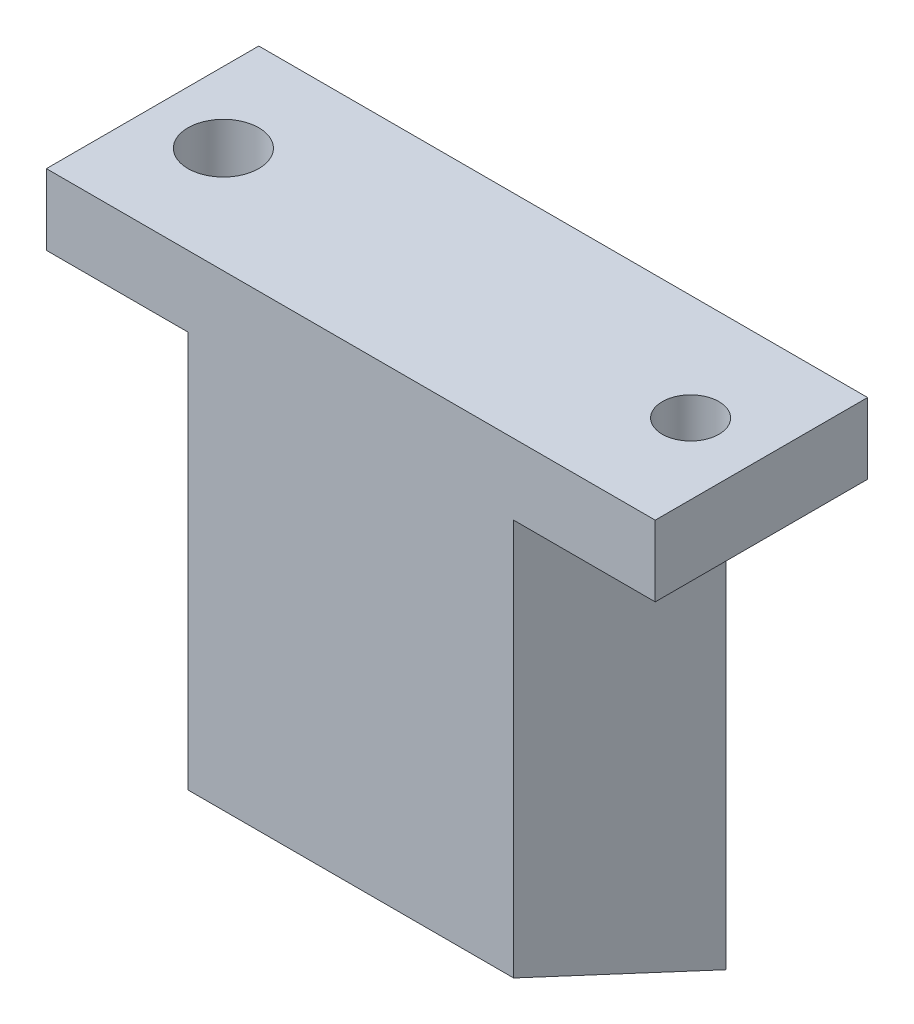
ISO-10303-21;
HEADER;
FILE_DESCRIPTION(('STEP AP214'),'2;1');
FILE_NAME('part.step','',(''),(''),'','','');
FILE_SCHEMA(('AUTOMOTIVE_DESIGN { 1 0 10303 214 1 1 1 1 }'));
ENDSEC;
DATA;
#1=APPLICATION_CONTEXT('core data for automotive mechanical design processes');
#2=APPLICATION_PROTOCOL_DEFINITION('international standard','automotive_design',2000,#1);
#3=PRODUCT_CONTEXT('',#1,'mechanical');
#4=PRODUCT('Part','Part','',(#3));
#5=PRODUCT_RELATED_PRODUCT_CATEGORY('part','',(#4));
#6=PRODUCT_DEFINITION_FORMATION('','',#4);
#7=PRODUCT_DEFINITION_CONTEXT('part definition',#1,'design');
#8=PRODUCT_DEFINITION('design','',#6,#7);
#9=PRODUCT_DEFINITION_SHAPE('','',#8);
#10=(LENGTH_UNIT() NAMED_UNIT(*) SI_UNIT(.MILLI.,.METRE.));
#11=(NAMED_UNIT(*) PLANE_ANGLE_UNIT() SI_UNIT($,.RADIAN.));
#12=(NAMED_UNIT(*) SI_UNIT($,.STERADIAN.) SOLID_ANGLE_UNIT());
#13=UNCERTAINTY_MEASURE_WITH_UNIT(LENGTH_MEASURE(1.E-05),#10,'distance_accuracy_value','');
#14=(GEOMETRIC_REPRESENTATION_CONTEXT(3) GLOBAL_UNCERTAINTY_ASSIGNED_CONTEXT((#13)) GLOBAL_UNIT_ASSIGNED_CONTEXT((#10,
#11,#12)) REPRESENTATION_CONTEXT('',''));
#15=CARTESIAN_POINT('',(0.,0.,0.));
#16=DIRECTION('',(0.,0.,1.));
#17=DIRECTION('',(1.,0.,0.));
#18=AXIS2_PLACEMENT_3D('',#15,#16,#17);
#19=CARTESIAN_POINT('',(-76.9047619047619,40.,-16.0714285714286));
#20=DIRECTION('',(1.,0.,0.));
#21=DIRECTION('',(0.,0.,-1.));
#22=AXIS2_PLACEMENT_3D('',#19,#20,#21);
#23=PLANE('',#22);
#24=DIRECTION('',(0.,0.,1.));
#25=VECTOR('',#24,1.);
#26=CARTESIAN_POINT('',(-76.9047619047619,35.,-16.0714285714286));
#27=LINE('',#26,#25);
#28=CARTESIAN_POINT('',(-76.9047619047619,35.,-16.0714285714286));
#29=VERTEX_POINT('',#28);
#30=CARTESIAN_POINT('',(-76.9047619047619,35.,-1.07142857142857));
#31=VERTEX_POINT('',#30);
#32=EDGE_CURVE('E47',#29,#31,#27,.T.);
#33=ORIENTED_EDGE('',*,*,#32,.F.);
#34=DIRECTION('',(0.,-1.,0.));
#35=VECTOR('',#34,1.);
#36=CARTESIAN_POINT('',(-76.9047619047619,40.,-16.0714285714286));
#37=LINE('',#36,#35);
#38=CARTESIAN_POINT('',(-76.9047619047619,0.,-16.0714285714286));
#39=VERTEX_POINT('',#38);
#40=EDGE_CURVE('E118',#29,#39,#37,.T.);
#41=ORIENTED_EDGE('',*,*,#40,.T.);
#42=DIRECTION('',(0.,0.422618261740694,0.906307787036653));
#43=VECTOR('',#42,1.);
#44=CARTESIAN_POINT('',(-76.9047619047619,7.14424780626901,-0.750539709049177));
#45=LINE('',#44,#43);
#46=CARTESIAN_POINT('',(-76.9047619047619,6.99461487232486,-1.07142857142855));
#47=VERTEX_POINT('',#46);
#48=EDGE_CURVE('E152',#39,#47,#45,.T.);
#49=ORIENTED_EDGE('',*,*,#48,.T.);
#50=DIRECTION('',(0.,-1.,0.));
#51=VECTOR('',#50,1.);
#52=CARTESIAN_POINT('',(-76.9047619047619,40.,-1.07142857142857));
#53=LINE('',#52,#51);
#54=EDGE_CURVE('E11',#31,#47,#53,.T.);
#55=ORIENTED_EDGE('',*,*,#54,.F.);
#56=EDGE_LOOP('',(#33,#41,#49,#55));
#57=FACE_BOUND('',#56,.T.);
#58=ADVANCED_FACE('F33',(#57),#23,.F.);
#59=CARTESIAN_POINT('',(-53.9047619047619,40.,-16.0714285714286));
#60=DIRECTION('',(-1.,0.,0.));
#61=DIRECTION('',(0.,0.,1.));
#62=AXIS2_PLACEMENT_3D('',#59,#60,#61);
#63=PLANE('',#62);
#64=DIRECTION('',(0.,0.,-1.));
#65=VECTOR('',#64,1.);
#66=CARTESIAN_POINT('',(-53.9047619047619,35.,-16.0714285714286));
#67=LINE('',#66,#65);
#68=CARTESIAN_POINT('',(-53.9047619047619,35.,-1.07142857142857));
#69=VERTEX_POINT('',#68);
#70=CARTESIAN_POINT('',(-53.9047619047619,35.,-16.0714285714286));
#71=VERTEX_POINT('',#70);
#72=EDGE_CURVE('E55',#69,#71,#67,.T.);
#73=ORIENTED_EDGE('',*,*,#72,.F.);
#74=DIRECTION('',(0.,-1.,0.));
#75=VECTOR('',#74,1.);
#76=CARTESIAN_POINT('',(-53.9047619047619,40.,-1.07142857142857));
#77=LINE('',#76,#75);
#78=CARTESIAN_POINT('',(-53.9047619047619,6.99461487232486,-1.07142857142855));
#79=VERTEX_POINT('',#78);
#80=EDGE_CURVE('E40',#69,#79,#77,.T.);
#81=ORIENTED_EDGE('',*,*,#80,.T.);
#82=DIRECTION('',(0.,0.422618261740694,0.906307787036653));
#83=VECTOR('',#82,1.);
#84=CARTESIAN_POINT('',(-53.9047619047619,6.99461487232486,-1.07142857142855));
#85=LINE('',#84,#83);
#86=CARTESIAN_POINT('',(-53.9047619047619,0.,-16.0714285714285));
#87=VERTEX_POINT('',#86);
#88=EDGE_CURVE('E146',#87,#79,#85,.T.);
#89=ORIENTED_EDGE('',*,*,#88,.F.);
#90=DIRECTION('',(0.,-1.,0.));
#91=VECTOR('',#90,1.);
#92=CARTESIAN_POINT('',(-53.9047619047619,40.,-16.0714285714286));
#93=LINE('',#92,#91);
#94=EDGE_CURVE('E162',#71,#87,#93,.T.);
#95=ORIENTED_EDGE('',*,*,#94,.F.);
#96=EDGE_LOOP('',(#73,#81,#89,#95));
#97=FACE_BOUND('',#96,.T.);
#98=ADVANCED_FACE('F164',(#97),#63,.F.);
#99=CARTESIAN_POINT('',(-76.9047619047619,40.,-1.07142857142857));
#100=DIRECTION('',(0.,0.,-1.));
#101=DIRECTION('',(-1.,0.,0.));
#102=AXIS2_PLACEMENT_3D('',#99,#100,#101);
#103=PLANE('',#102);
#104=DIRECTION('',(1.,0.,0.));
#105=VECTOR('',#104,1.);
#106=CARTESIAN_POINT('',(-76.9047619047619,40.,-1.07142857142857));
#107=LINE('',#106,#105);
#108=CARTESIAN_POINT('',(-86.9047619047619,40.,-1.07142857142856));
#109=VERTEX_POINT('',#108);
#110=CARTESIAN_POINT('',(-43.9047619047619,40.,-1.07142857142857));
#111=VERTEX_POINT('',#110);
#112=EDGE_CURVE('E156',#109,#111,#107,.T.);
#113=ORIENTED_EDGE('',*,*,#112,.F.);
#114=DIRECTION('',(0.,1.,0.));
#115=VECTOR('',#114,1.);
#116=CARTESIAN_POINT('',(-86.9047619047619,40.,-1.07142857142856));
#117=LINE('',#116,#115);
#118=CARTESIAN_POINT('',(-86.9047619047619,35.,-1.07142857142857));
#119=VERTEX_POINT('',#118);
#120=EDGE_CURVE('E106',#119,#109,#117,.T.);
#121=ORIENTED_EDGE('',*,*,#120,.F.);
#122=DIRECTION('',(1.,0.,0.));
#123=VECTOR('',#122,1.);
#124=CARTESIAN_POINT('',(-86.9047619047619,35.,-1.07142857142857));
#125=LINE('',#124,#123);
#126=EDGE_CURVE('E102',#119,#31,#125,.T.);
#127=ORIENTED_EDGE('',*,*,#126,.T.);
#128=ORIENTED_EDGE('',*,*,#54,.T.);
#129=DIRECTION('',(1.,0.,0.));
#130=VECTOR('',#129,1.);
#131=CARTESIAN_POINT('',(-93.9047619047619,6.99461487232486,-1.07142857142855));
#132=LINE('',#131,#130);
#133=EDGE_CURVE('E149',#47,#79,#132,.T.);
#134=ORIENTED_EDGE('',*,*,#133,.T.);
#135=ORIENTED_EDGE('',*,*,#80,.F.);
#136=DIRECTION('',(-1.,0.,0.));
#137=VECTOR('',#136,1.);
#138=CARTESIAN_POINT('',(-43.9047619047619,35.,-1.07142857142857));
#139=LINE('',#138,#137);
#140=CARTESIAN_POINT('',(-43.9047619047619,35.,-1.07142857142857));
#141=VERTEX_POINT('',#140);
#142=EDGE_CURVE('E137',#141,#69,#139,.T.);
#143=ORIENTED_EDGE('',*,*,#142,.F.);
#144=DIRECTION('',(0.,-1.,0.));
#145=VECTOR('',#144,1.);
#146=CARTESIAN_POINT('',(-43.9047619047619,40.,-1.07142857142857));
#147=LINE('',#146,#145);
#148=EDGE_CURVE('E130',#111,#141,#147,.T.);
#149=ORIENTED_EDGE('',*,*,#148,.F.);
#150=EDGE_LOOP('',(#113,#121,#127,#128,#134,#135,#143,#149));
#151=FACE_BOUND('',#150,.T.);
#152=ADVANCED_FACE('F172',(#151),#103,.F.);
#153=CARTESIAN_POINT('',(-76.9047619047619,40.,-16.0714285714286));
#154=DIRECTION('',(0.,0.,1.));
#155=DIRECTION('',(1.,0.,0.));
#156=AXIS2_PLACEMENT_3D('',#153,#154,#155);
#157=PLANE('',#156);
#158=CARTESIAN_POINT('',(-65.3785954655315,21.4157068063249,-16.0714285714286));
#159=DIRECTION('',(0.,0.,1.));
#160=DIRECTION('',(0.,-1.,0.));
#161=AXIS2_PLACEMENT_3D('',#158,#159,#160);
#162=ELLIPSE('',#161,3.54930237472879,1.5);
#163=CARTESIAN_POINT('',(-65.3785954655315,17.8664044315961,-16.0714285714286));
#164=VERTEX_POINT('',#163);
#165=EDGE_CURVE('E143',#164,#164,#162,.T.);
#166=ORIENTED_EDGE('',*,*,#165,.T.);
#167=EDGE_LOOP('',(#166));
#168=FACE_BOUND('',#167,.T.);
#169=DIRECTION('',(-1.,0.,0.));
#170=VECTOR('',#169,1.);
#171=CARTESIAN_POINT('',(-76.9047619047619,0.,-16.0714285714286));
#172=LINE('',#171,#170);
#173=EDGE_CURVE('E155',#87,#39,#172,.T.);
#174=ORIENTED_EDGE('',*,*,#173,.T.);
#175=ORIENTED_EDGE('',*,*,#40,.F.);
#176=DIRECTION('',(1.,0.,0.));
#177=VECTOR('',#176,1.);
#178=CARTESIAN_POINT('',(-86.9047619047619,35.,-16.0714285714286));
#179=LINE('',#178,#177);
#180=CARTESIAN_POINT('',(-86.9047619047619,35.,-16.0714285714286));
#181=VERTEX_POINT('',#180);
#182=EDGE_CURVE('E100',#181,#29,#179,.T.);
#183=ORIENTED_EDGE('',*,*,#182,.F.);
#184=DIRECTION('',(0.,-1.,0.));
#185=VECTOR('',#184,1.);
#186=CARTESIAN_POINT('',(-86.9047619047619,40.,-16.0714285714286));
#187=LINE('',#186,#185);
#188=CARTESIAN_POINT('',(-86.9047619047619,40.,-16.0714285714286));
#189=VERTEX_POINT('',#188);
#190=EDGE_CURVE('E107',#189,#181,#187,.T.);
#191=ORIENTED_EDGE('',*,*,#190,.F.);
#192=DIRECTION('',(-1.,0.,0.));
#193=VECTOR('',#192,1.);
#194=CARTESIAN_POINT('',(-76.9047619047619,40.,-16.0714285714286));
#195=LINE('',#194,#193);
#196=CARTESIAN_POINT('',(-43.9047619047619,40.,-16.0714285714286));
#197=VERTEX_POINT('',#196);
#198=EDGE_CURVE('E158',#197,#189,#195,.T.);
#199=ORIENTED_EDGE('',*,*,#198,.F.);
#200=DIRECTION('',(0.,1.,0.));
#201=VECTOR('',#200,1.);
#202=CARTESIAN_POINT('',(-43.9047619047619,40.,-16.0714285714286));
#203=LINE('',#202,#201);
#204=CARTESIAN_POINT('',(-43.9047619047619,35.,-16.0714285714286));
#205=VERTEX_POINT('',#204);
#206=EDGE_CURVE('E120',#205,#197,#203,.T.);
#207=ORIENTED_EDGE('',*,*,#206,.F.);
#208=DIRECTION('',(-1.,0.,0.));
#209=VECTOR('',#208,1.);
#210=CARTESIAN_POINT('',(-43.9047619047619,35.,-16.0714285714286));
#211=LINE('',#210,#209);
#212=EDGE_CURVE('E133',#205,#71,#211,.T.);
#213=ORIENTED_EDGE('',*,*,#212,.T.);
#214=ORIENTED_EDGE('',*,*,#94,.T.);
#215=EDGE_LOOP('',(#174,#175,#183,#191,#199,#207,#213,#214));
#216=FACE_BOUND('',#215,.T.);
#217=ADVANCED_FACE('F117',(#168,#216),#157,.F.);
#218=CARTESIAN_POINT('',(0.,40.,0.));
#219=DIRECTION('',(0.,1.,0.));
#220=DIRECTION('',(0.,0.,1.));
#221=AXIS2_PLACEMENT_3D('',#218,#219,#220);
#222=PLANE('',#221);
#223=CARTESIAN_POINT('',(-81.9047619047619,40.,-8.57142857142857));
#224=DIRECTION('',(0.,1.,0.));
#225=DIRECTION('',(0.,0.,1.));
#226=AXIS2_PLACEMENT_3D('',#223,#224,#225);
#227=CIRCLE('',#226,2.50000000000001);
#228=CARTESIAN_POINT('',(-81.9047619047619,40.,-6.07142857142856));
#229=VERTEX_POINT('',#228);
#230=EDGE_CURVE('E175',#229,#229,#227,.T.);
#231=ORIENTED_EDGE('',*,*,#230,.F.);
#232=EDGE_LOOP('',(#231));
#233=FACE_BOUND('',#232,.T.);
#234=CARTESIAN_POINT('',(-48.9047619047619,40.,-8.57142857142857));
#235=DIRECTION('',(0.,1.,0.));
#236=DIRECTION('',(0.,0.,1.));
#237=AXIS2_PLACEMENT_3D('',#234,#235,#236);
#238=CIRCLE('',#237,2.);
#239=CARTESIAN_POINT('',(-48.9047619047619,40.,-6.57142857142857));
#240=VERTEX_POINT('',#239);
#241=EDGE_CURVE('E173',#240,#240,#238,.T.);
#242=ORIENTED_EDGE('',*,*,#241,.F.);
#243=EDGE_LOOP('',(#242));
#244=FACE_BOUND('',#243,.T.);
#245=ORIENTED_EDGE('',*,*,#198,.T.);
#246=DIRECTION('',(0.,0.,-1.));
#247=VECTOR('',#246,1.);
#248=CARTESIAN_POINT('',(-86.9047619047619,40.,-16.0714285714286));
#249=LINE('',#248,#247);
#250=EDGE_CURVE('E113',#109,#189,#249,.T.);
#251=ORIENTED_EDGE('',*,*,#250,.F.);
#252=ORIENTED_EDGE('',*,*,#112,.T.);
#253=DIRECTION('',(0.,0.,1.));
#254=VECTOR('',#253,1.);
#255=CARTESIAN_POINT('',(-43.9047619047619,40.,-16.0714285714286));
#256=LINE('',#255,#254);
#257=EDGE_CURVE('E127',#197,#111,#256,.T.);
#258=ORIENTED_EDGE('',*,*,#257,.F.);
#259=EDGE_LOOP('',(#245,#251,#252,#258));
#260=FACE_BOUND('',#259,.T.);
#261=ADVANCED_FACE('F213',(#233,#244,#260),#222,.T.);
#262=CARTESIAN_POINT('',(-93.9047619047619,6.99461487232486,-1.07142857142855));
#263=DIRECTION('',(0.,0.906307787036653,-0.422618261740694));
#264=DIRECTION('',(0.,0.422618261740694,0.906307787036653));
#265=AXIS2_PLACEMENT_3D('',#262,#263,#264);
#266=PLANE('',#265);
#267=CARTESIAN_POINT('',(-65.3785954655315,3.82497790926966,-7.86873697420344));
#268=DIRECTION('',(0.,-0.906307787036653,0.422618261740693));
#269=DIRECTION('',(0.,-0.422618261740693,-0.906307787036653));
#270=AXIS2_PLACEMENT_3D('',#267,#268,#269);
#271=CIRCLE('',#270,1.5);
#272=CARTESIAN_POINT('',(-65.3785954655315,3.19105051665862,-9.22819865475842));
#273=VERTEX_POINT('',#272);
#274=EDGE_CURVE('E140',#273,#273,#271,.T.);
#275=ORIENTED_EDGE('',*,*,#274,.F.);
#276=EDGE_LOOP('',(#275));
#277=FACE_BOUND('',#276,.T.);
#278=ORIENTED_EDGE('',*,*,#173,.F.);
#279=ORIENTED_EDGE('',*,*,#88,.T.);
#280=ORIENTED_EDGE('',*,*,#133,.F.);
#281=ORIENTED_EDGE('',*,*,#48,.F.);
#282=EDGE_LOOP('',(#278,#279,#280,#281));
#283=FACE_BOUND('',#282,.T.);
#284=ADVANCED_FACE('F170',(#277,#283),#266,.F.);
#285=CARTESIAN_POINT('',(-65.3785954655315,36.4520582425892,-23.0829943968684));
#286=DIRECTION('',(0.,-0.906307787036653,0.422618261740693));
#287=DIRECTION('',(0.,-0.422618261740693,-0.906307787036653));
#288=AXIS2_PLACEMENT_3D('',#285,#286,#287);
#289=CYLINDRICAL_SURFACE('',#288,1.5);
#290=ORIENTED_EDGE('',*,*,#274,.T.);
#291=EDGE_LOOP('',(#290));
#292=FACE_BOUND('',#291,.T.);
#293=ORIENTED_EDGE('',*,*,#165,.F.);
#294=EDGE_LOOP('',(#293));
#295=FACE_BOUND('',#294,.T.);
#296=ADVANCED_FACE('F220',(#292,#295),#289,.F.);
#297=CARTESIAN_POINT('',(-43.9047619047619,35.,-16.0714285714286));
#298=DIRECTION('',(0.,1.,0.));
#299=DIRECTION('',(0.,0.,1.));
#300=AXIS2_PLACEMENT_3D('',#297,#298,#299);
#301=PLANE('',#300);
#302=CARTESIAN_POINT('',(-48.9047619047619,35.,-8.57142857142857));
#303=DIRECTION('',(0.,-1.,0.));
#304=DIRECTION('',(0.,0.,-1.));
#305=AXIS2_PLACEMENT_3D('',#302,#303,#304);
#306=CIRCLE('',#305,2.);
#307=CARTESIAN_POINT('',(-48.9047619047619,35.,-10.5714285714286));
#308=VERTEX_POINT('',#307);
#309=EDGE_CURVE('E183',#308,#308,#306,.T.);
#310=ORIENTED_EDGE('',*,*,#309,.F.);
#311=EDGE_LOOP('',(#310));
#312=FACE_BOUND('',#311,.T.);
#313=ORIENTED_EDGE('',*,*,#72,.T.);
#314=ORIENTED_EDGE('',*,*,#212,.F.);
#315=DIRECTION('',(0.,0.,-1.));
#316=VECTOR('',#315,1.);
#317=CARTESIAN_POINT('',(-43.9047619047619,35.,-16.0714285714286));
#318=LINE('',#317,#316);
#319=EDGE_CURVE('E132',#141,#205,#318,.T.);
#320=ORIENTED_EDGE('',*,*,#319,.F.);
#321=ORIENTED_EDGE('',*,*,#142,.T.);
#322=EDGE_LOOP('',(#313,#314,#320,#321));
#323=FACE_BOUND('',#322,.T.);
#324=ADVANCED_FACE('F199',(#312,#323),#301,.F.);
#325=CARTESIAN_POINT('',(-43.9047619047619,0.,0.));
#326=DIRECTION('',(-1.,0.,0.));
#327=DIRECTION('',(0.,0.,1.));
#328=AXIS2_PLACEMENT_3D('',#325,#326,#327);
#329=PLANE('',#328);
#330=ORIENTED_EDGE('',*,*,#206,.T.);
#331=ORIENTED_EDGE('',*,*,#257,.T.);
#332=ORIENTED_EDGE('',*,*,#148,.T.);
#333=ORIENTED_EDGE('',*,*,#319,.T.);
#334=EDGE_LOOP('',(#330,#331,#332,#333));
#335=FACE_BOUND('',#334,.T.);
#336=ADVANCED_FACE('F192',(#335),#329,.F.);
#337=CARTESIAN_POINT('',(-86.9047619047619,35.,-16.0714285714286));
#338=DIRECTION('',(0.,1.,0.));
#339=DIRECTION('',(0.,0.,1.));
#340=AXIS2_PLACEMENT_3D('',#337,#338,#339);
#341=PLANE('',#340);
#342=CARTESIAN_POINT('',(-81.9047619047619,35.,-8.57142857142857));
#343=DIRECTION('',(0.,-1.,0.));
#344=DIRECTION('',(0.,0.,-1.));
#345=AXIS2_PLACEMENT_3D('',#342,#343,#344);
#346=CIRCLE('',#345,2.50000000000001);
#347=CARTESIAN_POINT('',(-81.9047619047619,35.,-11.0714285714286));
#348=VERTEX_POINT('',#347);
#349=EDGE_CURVE('E182',#348,#348,#346,.T.);
#350=ORIENTED_EDGE('',*,*,#349,.F.);
#351=EDGE_LOOP('',(#350));
#352=FACE_BOUND('',#351,.T.);
#353=ORIENTED_EDGE('',*,*,#32,.T.);
#354=ORIENTED_EDGE('',*,*,#126,.F.);
#355=DIRECTION('',(0.,0.,1.));
#356=VECTOR('',#355,1.);
#357=CARTESIAN_POINT('',(-86.9047619047619,35.,-16.0714285714286));
#358=LINE('',#357,#356);
#359=EDGE_CURVE('E96',#181,#119,#358,.T.);
#360=ORIENTED_EDGE('',*,*,#359,.F.);
#361=ORIENTED_EDGE('',*,*,#182,.T.);
#362=EDGE_LOOP('',(#353,#354,#360,#361));
#363=FACE_BOUND('',#362,.T.);
#364=ADVANCED_FACE('F98',(#352,#363),#341,.F.);
#365=CARTESIAN_POINT('',(-86.9047619047619,0.,0.));
#366=DIRECTION('',(-1.,0.,0.));
#367=DIRECTION('',(0.,0.,1.));
#368=AXIS2_PLACEMENT_3D('',#365,#366,#367);
#369=PLANE('',#368);
#370=ORIENTED_EDGE('',*,*,#190,.T.);
#371=ORIENTED_EDGE('',*,*,#359,.T.);
#372=ORIENTED_EDGE('',*,*,#120,.T.);
#373=ORIENTED_EDGE('',*,*,#250,.T.);
#374=EDGE_LOOP('',(#370,#371,#372,#373));
#375=FACE_BOUND('',#374,.T.);
#376=ADVANCED_FACE('F111',(#375),#369,.T.);
#377=CARTESIAN_POINT('',(-81.9047619047619,45.,-8.57142857142857));
#378=DIRECTION('',(0.,-1.,0.));
#379=DIRECTION('',(0.,0.,-1.));
#380=AXIS2_PLACEMENT_3D('',#377,#378,#379);
#381=CYLINDRICAL_SURFACE('',#380,2.50000000000001);
#382=ORIENTED_EDGE('',*,*,#230,.T.);
#383=EDGE_LOOP('',(#382));
#384=FACE_BOUND('',#383,.T.);
#385=ORIENTED_EDGE('',*,*,#349,.T.);
#386=EDGE_LOOP('',(#385));
#387=FACE_BOUND('',#386,.T.);
#388=ADVANCED_FACE('F189',(#384,#387),#381,.F.);
#389=CARTESIAN_POINT('',(-48.9047619047619,45.,-8.57142857142857));
#390=DIRECTION('',(0.,-1.,0.));
#391=DIRECTION('',(0.,0.,-1.));
#392=AXIS2_PLACEMENT_3D('',#389,#390,#391);
#393=CYLINDRICAL_SURFACE('',#392,2.);
#394=ORIENTED_EDGE('',*,*,#241,.T.);
#395=EDGE_LOOP('',(#394));
#396=FACE_BOUND('',#395,.T.);
#397=ORIENTED_EDGE('',*,*,#309,.T.);
#398=EDGE_LOOP('',(#397));
#399=FACE_BOUND('',#398,.T.);
#400=ADVANCED_FACE('F238',(#396,#399),#393,.F.);
#401=CLOSED_SHELL('',(#58,#98,#152,#217,#261,#284,#296,#324,#336,#364,#376,#388,#400));
#402=MANIFOLD_SOLID_BREP('B2',#401);
#403=ADVANCED_BREP_SHAPE_REPRESENTATION('',(#18,#402),#14);
#404=SHAPE_DEFINITION_REPRESENTATION(#9,#403);
ENDSEC;
END-ISO-10303-21;
